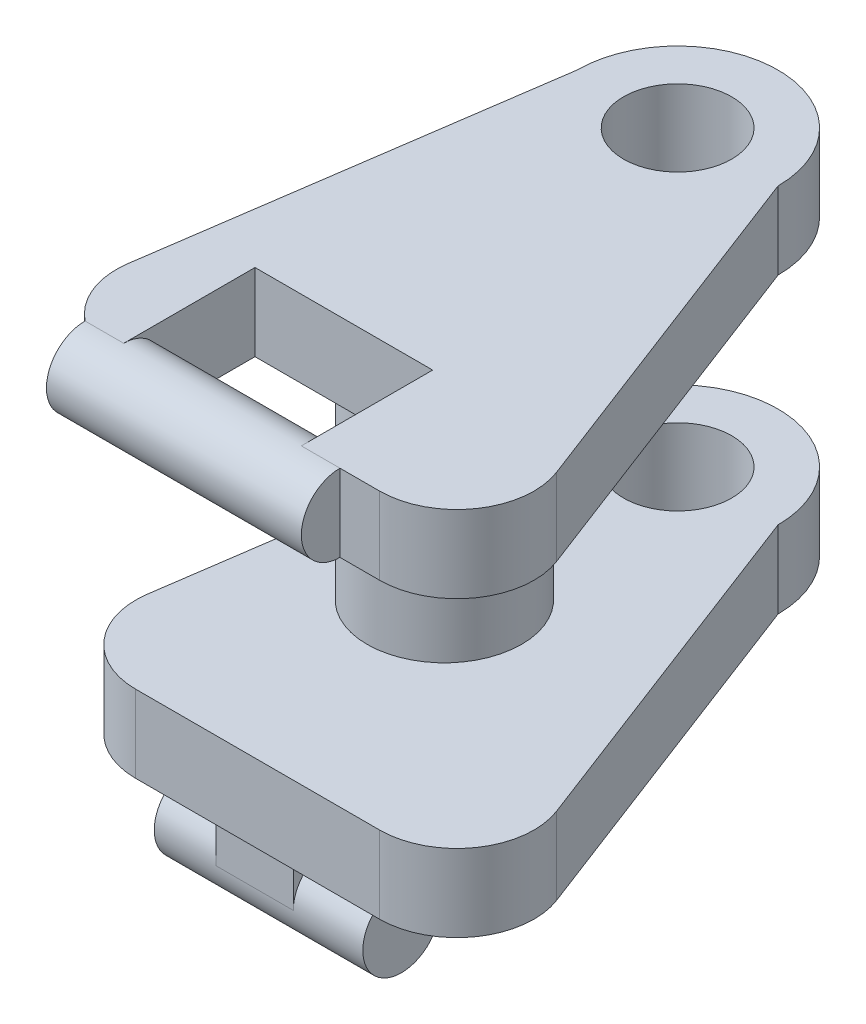
ISO-10303-21;
HEADER;
FILE_DESCRIPTION(('STEP AP214'),'2;1');
FILE_NAME('part.step','',(''),(''),'','','');
FILE_SCHEMA(('AUTOMOTIVE_DESIGN { 1 0 10303 214 1 1 1 1 }'));
ENDSEC;
DATA;
#1=APPLICATION_CONTEXT('core data for automotive mechanical design processes');
#2=APPLICATION_PROTOCOL_DEFINITION('international standard','automotive_design',2000,#1);
#3=PRODUCT_CONTEXT('',#1,'mechanical');
#4=PRODUCT('Part','Part','',(#3));
#5=PRODUCT_RELATED_PRODUCT_CATEGORY('part','',(#4));
#6=PRODUCT_DEFINITION_FORMATION('','',#4);
#7=PRODUCT_DEFINITION_CONTEXT('part definition',#1,'design');
#8=PRODUCT_DEFINITION('design','',#6,#7);
#9=PRODUCT_DEFINITION_SHAPE('','',#8);
#10=(LENGTH_UNIT() NAMED_UNIT(*) SI_UNIT(.MILLI.,.METRE.));
#11=(NAMED_UNIT(*) PLANE_ANGLE_UNIT() SI_UNIT($,.RADIAN.));
#12=(NAMED_UNIT(*) SI_UNIT($,.STERADIAN.) SOLID_ANGLE_UNIT());
#13=UNCERTAINTY_MEASURE_WITH_UNIT(LENGTH_MEASURE(1.E-05),#10,'distance_accuracy_value','');
#14=(GEOMETRIC_REPRESENTATION_CONTEXT(3) GLOBAL_UNCERTAINTY_ASSIGNED_CONTEXT((#13)) GLOBAL_UNIT_ASSIGNED_CONTEXT((#10,
#11,#12)) REPRESENTATION_CONTEXT('',''));
#15=CARTESIAN_POINT('',(0.,0.,0.));
#16=DIRECTION('',(0.,0.,1.));
#17=DIRECTION('',(1.,0.,0.));
#18=AXIS2_PLACEMENT_3D('',#15,#16,#17);
#19=CARTESIAN_POINT('',(16.0525087599727,-38.,-30.));
#20=DIRECTION('',(0.,-1.,0.));
#21=DIRECTION('',(0.,0.,-1.));
#22=AXIS2_PLACEMENT_3D('',#19,#20,#21);
#23=PLANE('',#22);
#24=DIRECTION('',(-0.357343434528091,0.,-0.933973056249305));
#25=VECTOR('',#24,1.);
#26=CARTESIAN_POINT('',(45.5378309625569,-38.,-17.4230346456334));
#27=LINE('',#26,#25);
#28=CARTESIAN_POINT('',(47.0107100608177,-38.,-13.5734343452809));
#29=VERTEX_POINT('',#28);
#30=CARTESIAN_POINT('',(29.2476404375621,-38.,-60.));
#31=VERTEX_POINT('',#30);
#32=EDGE_CURVE('E256',#29,#31,#27,.T.);
#33=ORIENTED_EDGE('',*,*,#32,.F.);
#34=CARTESIAN_POINT('',(37.6709794983246,-38.,-10.));
#35=DIRECTION('',(0.,-1.,0.));
#36=DIRECTION('',(0.,0.,-1.));
#37=AXIS2_PLACEMENT_3D('',#34,#35,#36);
#38=CIRCLE('',#37,10.);
#39=CARTESIAN_POINT('',(37.6709794983246,-38.,0.));
#40=VERTEX_POINT('',#39);
#41=EDGE_CURVE('E335',#29,#40,#38,.T.);
#42=ORIENTED_EDGE('',*,*,#41,.T.);
#43=DIRECTION('',(1.,0.,0.));
#44=VECTOR('',#43,1.);
#45=CARTESIAN_POINT('',(0.,-38.,0.));
#46=LINE('',#45,#44);
#47=CARTESIAN_POINT('',(6.09364936911274,-38.,0.));
#48=VERTEX_POINT('',#47);
#49=EDGE_CURVE('E258',#48,#40,#46,.T.);
#50=ORIENTED_EDGE('',*,*,#49,.F.);
#51=CARTESIAN_POINT('',(6.09364936911274,-38.,-10.));
#52=DIRECTION('',(0.,-1.,0.));
#53=DIRECTION('',(0.,0.,-1.));
#54=AXIS2_PLACEMENT_3D('',#51,#52,#53);
#55=CIRCLE('',#54,10.);
#56=CARTESIAN_POINT('',(-3.80260666620653,-38.,-11.4367033386914));
#57=VERTEX_POINT('',#56);
#58=EDGE_CURVE('E333',#48,#57,#55,.T.);
#59=ORIENTED_EDGE('',*,*,#58,.T.);
#60=DIRECTION('',(-0.143670333869138,0.,0.989625603531927));
#61=VECTOR('',#60,1.);
#62=CARTESIAN_POINT('',(-5.3501850959242,-38.,-0.776720889445257));
#63=LINE('',#62,#61);
#64=CARTESIAN_POINT('',(3.24764043756206,-38.,-60.));
#65=VERTEX_POINT('',#64);
#66=EDGE_CURVE('E249',#65,#57,#63,.T.);
#67=ORIENTED_EDGE('',*,*,#66,.F.);
#68=CARTESIAN_POINT('',(16.2476404375621,-38.,-60.));
#69=DIRECTION('',(0.,-1.,0.));
#70=DIRECTION('',(0.,0.,-1.));
#71=AXIS2_PLACEMENT_3D('',#68,#69,#70);
#72=CIRCLE('',#71,13.);
#73=EDGE_CURVE('E252',#65,#31,#72,.T.);
#74=ORIENTED_EDGE('',*,*,#73,.T.);
#75=EDGE_LOOP('',(#33,#42,#50,#59,#67,#74));
#76=FACE_BOUND('',#75,.T.);
#77=CARTESIAN_POINT('',(16.2476404375621,-38.,-60.));
#78=DIRECTION('',(0.,-1.,0.));
#79=DIRECTION('',(0.,0.,-1.));
#80=AXIS2_PLACEMENT_3D('',#77,#78,#79);
#81=CIRCLE('',#80,7.);
#82=CARTESIAN_POINT('',(16.2476404375621,-38.,-67.));
#83=VERTEX_POINT('',#82);
#84=EDGE_CURVE('E261',#83,#83,#81,.T.);
#85=ORIENTED_EDGE('',*,*,#84,.F.);
#86=EDGE_LOOP('',(#85));
#87=FACE_BOUND('',#86,.T.);
#88=DIRECTION('',(0.,0.,1.));
#89=VECTOR('',#88,1.);
#90=CARTESIAN_POINT('',(21.0936493691127,-38.,0.));
#91=LINE('',#90,#89);
#92=CARTESIAN_POINT('',(21.0936493691127,-38.,-15.3991887663422));
#93=VERTEX_POINT('',#92);
#94=CARTESIAN_POINT('',(21.0936493691127,-38.,-5.39918876634219));
#95=VERTEX_POINT('',#94);
#96=EDGE_CURVE('E50',#93,#95,#91,.T.);
#97=ORIENTED_EDGE('',*,*,#96,.F.);
#98=DIRECTION('',(1.,0.,0.));
#99=VECTOR('',#98,1.);
#100=CARTESIAN_POINT('',(0.,-38.,-15.3991887663422));
#101=LINE('',#100,#99);
#102=CARTESIAN_POINT('',(11.0936493691127,-38.,-15.3991887663422));
#103=VERTEX_POINT('',#102);
#104=EDGE_CURVE('E726',#103,#93,#101,.T.);
#105=ORIENTED_EDGE('',*,*,#104,.F.);
#106=DIRECTION('',(0.,0.,1.));
#107=VECTOR('',#106,1.);
#108=CARTESIAN_POINT('',(11.0936493691127,-38.,0.));
#109=LINE('',#108,#107);
#110=CARTESIAN_POINT('',(11.0936493691127,-38.,-5.39918876634219));
#111=VERTEX_POINT('',#110);
#112=EDGE_CURVE('E727',#103,#111,#109,.T.);
#113=ORIENTED_EDGE('',*,*,#112,.T.);
#114=DIRECTION('',(1.,0.,0.));
#115=VECTOR('',#114,1.);
#116=CARTESIAN_POINT('',(0.,-38.,-5.39918876634219));
#117=LINE('',#116,#115);
#118=EDGE_CURVE('E55',#111,#95,#117,.T.);
#119=ORIENTED_EDGE('',*,*,#118,.T.);
#120=EDGE_LOOP('',(#97,#105,#113,#119));
#121=FACE_BOUND('',#120,.T.);
#122=ADVANCED_FACE('F35',(#76,#87,#121),#23,.T.);
#123=CARTESIAN_POINT('',(0.,10.,0.));
#124=DIRECTION('',(0.,0.,-1.));
#125=DIRECTION('',(-1.,0.,0.));
#126=AXIS2_PLACEMENT_3D('',#123,#124,#125);
#127=PLANE('',#126);
#128=DIRECTION('',(1.,0.,0.));
#129=VECTOR('',#128,1.);
#130=CARTESIAN_POINT('',(0.,0.,0.));
#131=LINE('',#130,#129);
#132=CARTESIAN_POINT('',(32.5370533211989,0.,0.));
#133=VERTEX_POINT('',#132);
#134=CARTESIAN_POINT('',(37.6709794983246,0.,0.));
#135=VERTEX_POINT('',#134);
#136=EDGE_CURVE('E306',#133,#135,#131,.T.);
#137=ORIENTED_EDGE('',*,*,#136,.T.);
#138=DIRECTION('',(0.,-1.,0.));
#139=VECTOR('',#138,1.);
#140=CARTESIAN_POINT('',(37.6709794983246,10.,0.));
#141=LINE('',#140,#139);
#142=CARTESIAN_POINT('',(37.6709794983246,10.,0.));
#143=VERTEX_POINT('',#142);
#144=EDGE_CURVE('E350',#135,#143,#141,.F.);
#145=ORIENTED_EDGE('',*,*,#144,.T.);
#146=DIRECTION('',(1.,0.,0.));
#147=VECTOR('',#146,1.);
#148=CARTESIAN_POINT('',(0.,10.,0.));
#149=LINE('',#148,#147);
#150=CARTESIAN_POINT('',(32.5370533211989,10.,0.));
#151=VERTEX_POINT('',#150);
#152=EDGE_CURVE('E291',#151,#143,#149,.T.);
#153=ORIENTED_EDGE('',*,*,#152,.F.);
#154=DIRECTION('',(0.,1.,0.));
#155=VECTOR('',#154,1.);
#156=CARTESIAN_POINT('',(32.5370533211989,10.,0.));
#157=LINE('',#156,#155);
#158=EDGE_CURVE('E224',#133,#151,#157,.T.);
#159=ORIENTED_EDGE('',*,*,#158,.F.);
#160=EDGE_LOOP('',(#137,#145,#153,#159));
#161=FACE_BOUND('',#160,.T.);
#162=ADVANCED_FACE('F376',(#161),#127,.F.);
#163=CARTESIAN_POINT('',(16.0525087599727,-28.,-30.));
#164=DIRECTION('',(0.,1.,0.));
#165=DIRECTION('',(0.,0.,1.));
#166=AXIS2_PLACEMENT_3D('',#163,#164,#165);
#167=CYLINDRICAL_SURFACE('',#166,10.);
#168=CARTESIAN_POINT('',(16.0525087599727,0.,-30.));
#169=DIRECTION('',(0.,1.,0.));
#170=DIRECTION('',(0.,0.,1.));
#171=AXIS2_PLACEMENT_3D('',#168,#169,#170);
#172=CIRCLE('',#171,10.);
#173=CARTESIAN_POINT('',(16.0525087599727,0.,-20.));
#174=VERTEX_POINT('',#173);
#175=EDGE_CURVE('E316',#174,#174,#172,.F.);
#176=ORIENTED_EDGE('',*,*,#175,.T.);
#177=EDGE_LOOP('',(#176));
#178=FACE_BOUND('',#177,.T.);
#179=CARTESIAN_POINT('',(16.0525087599727,-28.,-30.));
#180=DIRECTION('',(0.,-1.,0.));
#181=DIRECTION('',(0.,0.,-1.));
#182=AXIS2_PLACEMENT_3D('',#179,#180,#181);
#183=CIRCLE('',#182,10.);
#184=CARTESIAN_POINT('',(16.0525087599727,-28.,-40.));
#185=VERTEX_POINT('',#184);
#186=EDGE_CURVE('E319',#185,#185,#183,.T.);
#187=ORIENTED_EDGE('',*,*,#186,.F.);
#188=EDGE_LOOP('',(#187));
#189=FACE_BOUND('',#188,.T.);
#190=ADVANCED_FACE('F418',(#178,#189),#167,.T.);
#191=CARTESIAN_POINT('',(45.5378309625569,10.,-17.4230346456334));
#192=DIRECTION('',(0.933973056249305,0.,-0.357343434528091));
#193=DIRECTION('',(-0.357343434528091,0.,-0.933973056249305));
#194=AXIS2_PLACEMENT_3D('',#191,#192,#193);
#195=PLANE('',#194);
#196=DIRECTION('',(0.357343434528091,0.,0.933973056249305));
#197=VECTOR('',#196,1.);
#198=CARTESIAN_POINT('',(45.5378309625569,10.,-17.4230346456334));
#199=LINE('',#198,#197);
#200=CARTESIAN_POINT('',(29.2476404375621,10.,-60.));
#201=VERTEX_POINT('',#200);
#202=CARTESIAN_POINT('',(47.0107100608177,10.,-13.5734343452809));
#203=VERTEX_POINT('',#202);
#204=EDGE_CURVE('E282',#201,#203,#199,.T.);
#205=ORIENTED_EDGE('',*,*,#204,.T.);
#206=DIRECTION('',(0.,-1.,0.));
#207=VECTOR('',#206,1.);
#208=CARTESIAN_POINT('',(47.0107100608177,0.,-13.5734343452809));
#209=LINE('',#208,#207);
#210=CARTESIAN_POINT('',(47.0107100608177,0.,-13.5734343452809));
#211=VERTEX_POINT('',#210);
#212=EDGE_CURVE('E343',#203,#211,#209,.T.);
#213=ORIENTED_EDGE('',*,*,#212,.T.);
#214=DIRECTION('',(0.357343434528091,0.,0.933973056249305));
#215=VECTOR('',#214,1.);
#216=CARTESIAN_POINT('',(45.5378309625569,0.,-17.4230346456334));
#217=LINE('',#216,#215);
#218=CARTESIAN_POINT('',(29.2476404375621,0.,-60.));
#219=VERTEX_POINT('',#218);
#220=EDGE_CURVE('E281',#219,#211,#217,.T.);
#221=ORIENTED_EDGE('',*,*,#220,.F.);
#222=DIRECTION('',(0.,-1.,0.));
#223=VECTOR('',#222,1.);
#224=CARTESIAN_POINT('',(29.2476404375621,10.,-60.));
#225=LINE('',#224,#223);
#226=EDGE_CURVE('E314',#201,#219,#225,.T.);
#227=ORIENTED_EDGE('',*,*,#226,.F.);
#228=EDGE_LOOP('',(#205,#213,#221,#227));
#229=FACE_BOUND('',#228,.T.);
#230=ADVANCED_FACE('F364',(#229),#195,.T.);
#231=CARTESIAN_POINT('',(16.2476404375621,10.,-60.));
#232=DIRECTION('',(0.,-1.,0.));
#233=DIRECTION('',(0.,0.,-1.));
#234=AXIS2_PLACEMENT_3D('',#231,#232,#233);
#235=CYLINDRICAL_SURFACE('',#234,13.);
#236=CARTESIAN_POINT('',(16.2476404375621,0.,-60.));
#237=DIRECTION('',(0.,1.,0.));
#238=DIRECTION('',(0.,0.,1.));
#239=AXIS2_PLACEMENT_3D('',#236,#237,#238);
#240=CIRCLE('',#239,13.);
#241=CARTESIAN_POINT('',(3.24764043756206,0.,-60.));
#242=VERTEX_POINT('',#241);
#243=EDGE_CURVE('E301',#219,#242,#240,.T.);
#244=ORIENTED_EDGE('',*,*,#243,.T.);
#245=DIRECTION('',(0.,-1.,0.));
#246=VECTOR('',#245,1.);
#247=CARTESIAN_POINT('',(3.24764043756206,10.,-60.));
#248=LINE('',#247,#246);
#249=CARTESIAN_POINT('',(3.24764043756206,10.,-60.));
#250=VERTEX_POINT('',#249);
#251=EDGE_CURVE('E298',#250,#242,#248,.T.);
#252=ORIENTED_EDGE('',*,*,#251,.F.);
#253=CARTESIAN_POINT('',(16.2476404375621,10.,-60.));
#254=DIRECTION('',(0.,1.,0.));
#255=DIRECTION('',(0.,0.,1.));
#256=AXIS2_PLACEMENT_3D('',#253,#254,#255);
#257=CIRCLE('',#256,13.);
#258=EDGE_CURVE('E285',#201,#250,#257,.T.);
#259=ORIENTED_EDGE('',*,*,#258,.F.);
#260=ORIENTED_EDGE('',*,*,#226,.T.);
#261=EDGE_LOOP('',(#244,#252,#259,#260));
#262=FACE_BOUND('',#261,.T.);
#263=ADVANCED_FACE('F409',(#262),#235,.T.);
#264=CARTESIAN_POINT('',(-5.3501850959242,10.,-0.776720889445257));
#265=DIRECTION('',(0.989625603531927,0.,0.143670333869138));
#266=DIRECTION('',(0.143670333869138,0.,-0.989625603531927));
#267=AXIS2_PLACEMENT_3D('',#264,#265,#266);
#268=PLANE('',#267);
#269=DIRECTION('',(-0.143670333869138,0.,0.989625603531927));
#270=VECTOR('',#269,1.);
#271=CARTESIAN_POINT('',(-5.3501850959242,0.,-0.776720889445257));
#272=LINE('',#271,#270);
#273=CARTESIAN_POINT('',(-4.11985181042444,0.,-9.25146503055053));
#274=VERTEX_POINT('',#273);
#275=EDGE_CURVE('E303',#242,#274,#272,.T.);
#276=ORIENTED_EDGE('',*,*,#275,.T.);
#277=DIRECTION('',(0.,1.,0.));
#278=VECTOR('',#277,1.);
#279=CARTESIAN_POINT('',(-4.11985181042444,10.,-9.25146503055053));
#280=LINE('',#279,#278);
#281=CARTESIAN_POINT('',(-4.11985181042445,10.,-9.25146503055053));
#282=VERTEX_POINT('',#281);
#283=EDGE_CURVE('E11',#274,#282,#280,.T.);
#284=ORIENTED_EDGE('',*,*,#283,.T.);
#285=DIRECTION('',(-0.143670333869138,0.,0.989625603531927));
#286=VECTOR('',#285,1.);
#287=CARTESIAN_POINT('',(-5.3501850959242,10.,-0.776720889445257));
#288=LINE('',#287,#286);
#289=EDGE_CURVE('E288',#250,#282,#288,.T.);
#290=ORIENTED_EDGE('',*,*,#289,.F.);
#291=ORIENTED_EDGE('',*,*,#251,.T.);
#292=EDGE_LOOP('',(#276,#284,#290,#291));
#293=FACE_BOUND('',#292,.T.);
#294=ADVANCED_FACE('F406',(#293),#268,.F.);
#295=CARTESIAN_POINT('',(16.2476404375621,10.,-60.));
#296=DIRECTION('',(0.,-1.,0.));
#297=DIRECTION('',(0.,0.,-1.));
#298=AXIS2_PLACEMENT_3D('',#295,#296,#297);
#299=CYLINDRICAL_SURFACE('',#298,7.);
#300=CARTESIAN_POINT('',(16.2476404375621,10.,-60.));
#301=DIRECTION('',(0.,1.,0.));
#302=DIRECTION('',(0.,0.,1.));
#303=AXIS2_PLACEMENT_3D('',#300,#301,#302);
#304=CIRCLE('',#303,7.);
#305=CARTESIAN_POINT('',(16.2476404375621,10.,-53.));
#306=VERTEX_POINT('',#305);
#307=EDGE_CURVE('E295',#306,#306,#304,.T.);
#308=ORIENTED_EDGE('',*,*,#307,.T.);
#309=EDGE_LOOP('',(#308));
#310=FACE_BOUND('',#309,.T.);
#311=CARTESIAN_POINT('',(16.2476404375621,0.,-60.));
#312=DIRECTION('',(0.,1.,0.));
#313=DIRECTION('',(0.,0.,1.));
#314=AXIS2_PLACEMENT_3D('',#311,#312,#313);
#315=CIRCLE('',#314,7.);
#316=CARTESIAN_POINT('',(16.2476404375621,0.,-53.));
#317=VERTEX_POINT('',#316);
#318=EDGE_CURVE('E286',#317,#317,#315,.T.);
#319=ORIENTED_EDGE('',*,*,#318,.F.);
#320=EDGE_LOOP('',(#319));
#321=FACE_BOUND('',#320,.T.);
#322=ADVANCED_FACE('F416',(#310,#321),#299,.F.);
#323=CARTESIAN_POINT('',(0.,10.,0.));
#324=DIRECTION('',(0.,1.,0.));
#325=DIRECTION('',(0.,0.,1.));
#326=AXIS2_PLACEMENT_3D('',#323,#324,#325);
#327=PLANE('',#326);
#328=ORIENTED_EDGE('',*,*,#152,.T.);
#329=CARTESIAN_POINT('',(37.6709794983246,10.,-10.));
#330=DIRECTION('',(0.,1.,0.));
#331=DIRECTION('',(0.,0.,1.));
#332=AXIS2_PLACEMENT_3D('',#329,#330,#331);
#333=CIRCLE('',#332,10.);
#334=EDGE_CURVE('E43',#143,#203,#333,.T.);
#335=ORIENTED_EDGE('',*,*,#334,.T.);
#336=ORIENTED_EDGE('',*,*,#204,.F.);
#337=ORIENTED_EDGE('',*,*,#258,.T.);
#338=ORIENTED_EDGE('',*,*,#289,.T.);
#339=CARTESIAN_POINT('',(5.77640422489483,10.,-7.81476169185915));
#340=DIRECTION('',(0.,1.,0.));
#341=DIRECTION('',(0.,0.,1.));
#342=AXIS2_PLACEMENT_3D('',#339,#340,#341);
#343=CIRCLE('',#342,10.);
#344=CARTESIAN_POINT('',(-0.462946678801066,10.,0.));
#345=VERTEX_POINT('',#344);
#346=EDGE_CURVE('E352',#282,#345,#343,.T.);
#347=ORIENTED_EDGE('',*,*,#346,.T.);
#348=DIRECTION('',(-1.,0.,0.));
#349=VECTOR('',#348,1.);
#350=CARTESIAN_POINT('',(32.5370533211989,10.,0.));
#351=LINE('',#350,#349);
#352=CARTESIAN_POINT('',(4.53705332119893,10.,0.));
#353=VERTEX_POINT('',#352);
#354=EDGE_CURVE('E216',#353,#345,#351,.T.);
#355=ORIENTED_EDGE('',*,*,#354,.F.);
#356=DIRECTION('',(0.,0.,1.));
#357=VECTOR('',#356,1.);
#358=CARTESIAN_POINT('',(4.53705332119893,10.,-17.));
#359=LINE('',#358,#357);
#360=CARTESIAN_POINT('',(4.53705332119893,10.,-17.));
#361=VERTEX_POINT('',#360);
#362=EDGE_CURVE('E241',#361,#353,#359,.T.);
#363=ORIENTED_EDGE('',*,*,#362,.F.);
#364=DIRECTION('',(-1.,0.,0.));
#365=VECTOR('',#364,1.);
#366=CARTESIAN_POINT('',(0.,10.,-17.));
#367=LINE('',#366,#365);
#368=CARTESIAN_POINT('',(27.5370533211989,10.,-17.));
#369=VERTEX_POINT('',#368);
#370=EDGE_CURVE('E232',#369,#361,#367,.T.);
#371=ORIENTED_EDGE('',*,*,#370,.F.);
#372=DIRECTION('',(0.,0.,1.));
#373=VECTOR('',#372,1.);
#374=CARTESIAN_POINT('',(27.5370533211989,10.,-17.));
#375=LINE('',#374,#373);
#376=CARTESIAN_POINT('',(27.5370533211989,10.,0.));
#377=VERTEX_POINT('',#376);
#378=EDGE_CURVE('E244',#369,#377,#375,.T.);
#379=ORIENTED_EDGE('',*,*,#378,.T.);
#380=EDGE_CURVE('E294',#377,#151,#149,.T.);
#381=ORIENTED_EDGE('',*,*,#380,.T.);
#382=EDGE_LOOP('',(#328,#335,#336,#337,#338,#347,#355,#363,#371,#379,#381));
#383=FACE_BOUND('',#382,.T.);
#384=ORIENTED_EDGE('',*,*,#307,.F.);
#385=EDGE_LOOP('',(#384));
#386=FACE_BOUND('',#385,.T.);
#387=ADVANCED_FACE('F356',(#383,#386),#327,.T.);
#388=CARTESIAN_POINT('',(0.,0.,0.));
#389=DIRECTION('',(0.,1.,0.));
#390=DIRECTION('',(0.,0.,1.));
#391=AXIS2_PLACEMENT_3D('',#388,#389,#390);
#392=PLANE('',#391);
#393=ORIENTED_EDGE('',*,*,#175,.F.);
#394=EDGE_LOOP('',(#393));
#395=FACE_BOUND('',#394,.T.);
#396=ORIENTED_EDGE('',*,*,#220,.T.);
#397=CARTESIAN_POINT('',(37.6709794983246,0.,-10.));
#398=DIRECTION('',(0.,1.,0.));
#399=DIRECTION('',(0.,0.,1.));
#400=AXIS2_PLACEMENT_3D('',#397,#398,#399);
#401=CIRCLE('',#400,10.);
#402=EDGE_CURVE('E348',#211,#135,#401,.F.);
#403=ORIENTED_EDGE('',*,*,#402,.T.);
#404=ORIENTED_EDGE('',*,*,#136,.F.);
#405=CARTESIAN_POINT('',(27.5370533211989,0.,0.));
#406=VERTEX_POINT('',#405);
#407=EDGE_CURVE('E309',#406,#133,#131,.T.);
#408=ORIENTED_EDGE('',*,*,#407,.F.);
#409=DIRECTION('',(0.,0.,1.));
#410=VECTOR('',#409,1.);
#411=CARTESIAN_POINT('',(27.5370533211989,0.,-17.));
#412=LINE('',#411,#410);
#413=CARTESIAN_POINT('',(27.5370533211989,0.,-17.));
#414=VERTEX_POINT('',#413);
#415=EDGE_CURVE('E236',#414,#406,#412,.T.);
#416=ORIENTED_EDGE('',*,*,#415,.F.);
#417=DIRECTION('',(1.,0.,0.));
#418=VECTOR('',#417,1.);
#419=CARTESIAN_POINT('',(0.,0.,-17.));
#420=LINE('',#419,#418);
#421=CARTESIAN_POINT('',(4.53705332119893,0.,-17.));
#422=VERTEX_POINT('',#421);
#423=EDGE_CURVE('E226',#422,#414,#420,.T.);
#424=ORIENTED_EDGE('',*,*,#423,.F.);
#425=DIRECTION('',(0.,0.,1.));
#426=VECTOR('',#425,1.);
#427=CARTESIAN_POINT('',(4.53705332119893,0.,-17.));
#428=LINE('',#427,#426);
#429=CARTESIAN_POINT('',(4.53705332119893,0.,0.));
#430=VERTEX_POINT('',#429);
#431=EDGE_CURVE('E237',#422,#430,#428,.T.);
#432=ORIENTED_EDGE('',*,*,#431,.T.);
#433=DIRECTION('',(-1.,0.,0.));
#434=VECTOR('',#433,1.);
#435=CARTESIAN_POINT('',(32.5370533211989,0.,0.));
#436=LINE('',#435,#434);
#437=CARTESIAN_POINT('',(-0.462946678801066,0.,0.));
#438=VERTEX_POINT('',#437);
#439=EDGE_CURVE('E213',#430,#438,#436,.T.);
#440=ORIENTED_EDGE('',*,*,#439,.T.);
#441=CARTESIAN_POINT('',(5.77640422489483,0.,-7.81476169185915));
#442=DIRECTION('',(0.,1.,0.));
#443=DIRECTION('',(0.,0.,1.));
#444=AXIS2_PLACEMENT_3D('',#441,#442,#443);
#445=CIRCLE('',#444,10.);
#446=EDGE_CURVE('E346',#438,#274,#445,.F.);
#447=ORIENTED_EDGE('',*,*,#446,.T.);
#448=ORIENTED_EDGE('',*,*,#275,.F.);
#449=ORIENTED_EDGE('',*,*,#243,.F.);
#450=EDGE_LOOP('',(#396,#403,#404,#408,#416,#424,#432,#440,#447,#448,#449));
#451=FACE_BOUND('',#450,.T.);
#452=ORIENTED_EDGE('',*,*,#318,.T.);
#453=EDGE_LOOP('',(#452));
#454=FACE_BOUND('',#453,.T.);
#455=ADVANCED_FACE('F370',(#395,#451,#454),#392,.F.);
#456=CARTESIAN_POINT('',(-5.3501850959242,-38.,-0.776720889445257));
#457=DIRECTION('',(-0.989625603531927,0.,-0.143670333869138));
#458=DIRECTION('',(-0.143670333869138,0.,0.989625603531927));
#459=AXIS2_PLACEMENT_3D('',#456,#457,#458);
#460=PLANE('',#459);
#461=ORIENTED_EDGE('',*,*,#66,.T.);
#462=DIRECTION('',(0.,1.,0.));
#463=VECTOR('',#462,1.);
#464=CARTESIAN_POINT('',(-3.80260666620653,-38.,-11.4367033386914));
#465=LINE('',#464,#463);
#466=CARTESIAN_POINT('',(-3.80260666620653,-28.,-11.4367033386914));
#467=VERTEX_POINT('',#466);
#468=EDGE_CURVE('E337',#57,#467,#465,.T.);
#469=ORIENTED_EDGE('',*,*,#468,.T.);
#470=DIRECTION('',(-0.143670333869138,0.,0.989625603531927));
#471=VECTOR('',#470,1.);
#472=CARTESIAN_POINT('',(-5.3501850959242,-28.,-0.776720889445257));
#473=LINE('',#472,#471);
#474=CARTESIAN_POINT('',(3.24764043756206,-28.,-60.));
#475=VERTEX_POINT('',#474);
#476=EDGE_CURVE('E240',#475,#467,#473,.T.);
#477=ORIENTED_EDGE('',*,*,#476,.F.);
#478=DIRECTION('',(0.,1.,0.));
#479=VECTOR('',#478,1.);
#480=CARTESIAN_POINT('',(3.24764043756206,-38.,-60.));
#481=LINE('',#480,#479);
#482=EDGE_CURVE('E279',#65,#475,#481,.T.);
#483=ORIENTED_EDGE('',*,*,#482,.F.);
#484=EDGE_LOOP('',(#461,#469,#477,#483));
#485=FACE_BOUND('',#484,.T.);
#486=ADVANCED_FACE('F431',(#485),#460,.T.);
#487=CARTESIAN_POINT('',(16.2476404375621,-38.,-60.));
#488=DIRECTION('',(0.,1.,0.));
#489=DIRECTION('',(0.,0.,1.));
#490=AXIS2_PLACEMENT_3D('',#487,#488,#489);
#491=CYLINDRICAL_SURFACE('',#490,13.);
#492=CARTESIAN_POINT('',(16.2476404375621,-28.,-60.));
#493=DIRECTION('',(0.,-1.,0.));
#494=DIRECTION('',(0.,0.,-1.));
#495=AXIS2_PLACEMENT_3D('',#492,#493,#494);
#496=CIRCLE('',#495,13.);
#497=CARTESIAN_POINT('',(29.2476404375621,-28.,-60.));
#498=VERTEX_POINT('',#497);
#499=EDGE_CURVE('E267',#475,#498,#496,.T.);
#500=ORIENTED_EDGE('',*,*,#499,.T.);
#501=DIRECTION('',(0.,1.,0.));
#502=VECTOR('',#501,1.);
#503=CARTESIAN_POINT('',(29.2476404375621,-38.,-60.));
#504=LINE('',#503,#502);
#505=EDGE_CURVE('E264',#31,#498,#504,.T.);
#506=ORIENTED_EDGE('',*,*,#505,.F.);
#507=ORIENTED_EDGE('',*,*,#73,.F.);
#508=ORIENTED_EDGE('',*,*,#482,.T.);
#509=EDGE_LOOP('',(#500,#506,#507,#508));
#510=FACE_BOUND('',#509,.T.);
#511=ADVANCED_FACE('F466',(#510),#491,.T.);
#512=CARTESIAN_POINT('',(45.5378309625569,-38.,-17.4230346456334));
#513=DIRECTION('',(0.933973056249305,0.,-0.357343434528091));
#514=DIRECTION('',(-0.357343434528091,0.,-0.933973056249305));
#515=AXIS2_PLACEMENT_3D('',#512,#513,#514);
#516=PLANE('',#515);
#517=DIRECTION('',(-0.357343434528091,0.,-0.933973056249305));
#518=VECTOR('',#517,1.);
#519=CARTESIAN_POINT('',(45.5378309625569,-28.,-17.4230346456334));
#520=LINE('',#519,#518);
#521=CARTESIAN_POINT('',(47.0107100608177,-28.,-13.5734343452809));
#522=VERTEX_POINT('',#521);
#523=EDGE_CURVE('E270',#522,#498,#520,.T.);
#524=ORIENTED_EDGE('',*,*,#523,.F.);
#525=DIRECTION('',(0.,1.,0.));
#526=VECTOR('',#525,1.);
#527=CARTESIAN_POINT('',(47.0107100608177,-38.,-13.5734343452809));
#528=LINE('',#527,#526);
#529=EDGE_CURVE('E331',#522,#29,#528,.F.);
#530=ORIENTED_EDGE('',*,*,#529,.T.);
#531=ORIENTED_EDGE('',*,*,#32,.T.);
#532=ORIENTED_EDGE('',*,*,#505,.T.);
#533=EDGE_LOOP('',(#524,#530,#531,#532));
#534=FACE_BOUND('',#533,.T.);
#535=ADVANCED_FACE('F475',(#534),#516,.T.);
#536=CARTESIAN_POINT('',(0.,-38.,0.));
#537=DIRECTION('',(0.,0.,1.));
#538=DIRECTION('',(1.,0.,0.));
#539=AXIS2_PLACEMENT_3D('',#536,#537,#538);
#540=PLANE('',#539);
#541=ORIENTED_EDGE('',*,*,#49,.T.);
#542=DIRECTION('',(0.,1.,0.));
#543=VECTOR('',#542,1.);
#544=CARTESIAN_POINT('',(37.6709794983246,-38.,0.));
#545=LINE('',#544,#543);
#546=CARTESIAN_POINT('',(37.6709794983246,-28.,0.));
#547=VERTEX_POINT('',#546);
#548=EDGE_CURVE('E324',#40,#547,#545,.T.);
#549=ORIENTED_EDGE('',*,*,#548,.T.);
#550=DIRECTION('',(1.,0.,0.));
#551=VECTOR('',#550,1.);
#552=CARTESIAN_POINT('',(0.,-28.,0.));
#553=LINE('',#552,#551);
#554=CARTESIAN_POINT('',(6.09364936911274,-28.,0.));
#555=VERTEX_POINT('',#554);
#556=EDGE_CURVE('E272',#555,#547,#553,.T.);
#557=ORIENTED_EDGE('',*,*,#556,.F.);
#558=DIRECTION('',(0.,1.,0.));
#559=VECTOR('',#558,1.);
#560=CARTESIAN_POINT('',(6.09364936911274,-38.,0.));
#561=LINE('',#560,#559);
#562=EDGE_CURVE('E322',#555,#48,#561,.F.);
#563=ORIENTED_EDGE('',*,*,#562,.T.);
#564=EDGE_LOOP('',(#541,#549,#557,#563));
#565=FACE_BOUND('',#564,.T.);
#566=ADVANCED_FACE('F481',(#565),#540,.T.);
#567=CARTESIAN_POINT('',(16.2476404375621,-38.,-60.));
#568=DIRECTION('',(0.,1.,0.));
#569=DIRECTION('',(0.,0.,1.));
#570=AXIS2_PLACEMENT_3D('',#567,#568,#569);
#571=CYLINDRICAL_SURFACE('',#570,7.);
#572=ORIENTED_EDGE('',*,*,#84,.T.);
#573=EDGE_LOOP('',(#572));
#574=FACE_BOUND('',#573,.T.);
#575=CARTESIAN_POINT('',(16.2476404375621,-28.,-60.));
#576=DIRECTION('',(0.,-1.,0.));
#577=DIRECTION('',(0.,0.,-1.));
#578=AXIS2_PLACEMENT_3D('',#575,#576,#577);
#579=CIRCLE('',#578,7.);
#580=CARTESIAN_POINT('',(16.2476404375621,-28.,-67.));
#581=VERTEX_POINT('',#580);
#582=EDGE_CURVE('E253',#581,#581,#579,.T.);
#583=ORIENTED_EDGE('',*,*,#582,.F.);
#584=EDGE_LOOP('',(#583));
#585=FACE_BOUND('',#584,.T.);
#586=ADVANCED_FACE('F489',(#574,#585),#571,.F.);
#587=CARTESIAN_POINT('',(0.,-28.,0.));
#588=DIRECTION('',(0.,-1.,0.));
#589=DIRECTION('',(0.,0.,-1.));
#590=AXIS2_PLACEMENT_3D('',#587,#588,#589);
#591=PLANE('',#590);
#592=ORIENTED_EDGE('',*,*,#556,.T.);
#593=CARTESIAN_POINT('',(37.6709794983246,-28.,-10.));
#594=DIRECTION('',(0.,-1.,0.));
#595=DIRECTION('',(0.,0.,-1.));
#596=AXIS2_PLACEMENT_3D('',#593,#594,#595);
#597=CIRCLE('',#596,10.);
#598=EDGE_CURVE('E329',#547,#522,#597,.F.);
#599=ORIENTED_EDGE('',*,*,#598,.T.);
#600=ORIENTED_EDGE('',*,*,#523,.T.);
#601=ORIENTED_EDGE('',*,*,#499,.F.);
#602=ORIENTED_EDGE('',*,*,#476,.T.);
#603=CARTESIAN_POINT('',(6.09364936911274,-28.,-10.));
#604=DIRECTION('',(0.,-1.,0.));
#605=DIRECTION('',(0.,0.,-1.));
#606=AXIS2_PLACEMENT_3D('',#603,#604,#605);
#607=CIRCLE('',#606,10.);
#608=EDGE_CURVE('E327',#467,#555,#607,.F.);
#609=ORIENTED_EDGE('',*,*,#608,.T.);
#610=EDGE_LOOP('',(#592,#599,#600,#601,#602,#609));
#611=FACE_BOUND('',#610,.T.);
#612=ORIENTED_EDGE('',*,*,#186,.T.);
#613=EDGE_LOOP('',(#612));
#614=FACE_BOUND('',#613,.T.);
#615=ORIENTED_EDGE('',*,*,#582,.T.);
#616=EDGE_LOOP('',(#615));
#617=FACE_BOUND('',#616,.T.);
#618=ADVANCED_FACE('F497',(#611,#614,#617),#591,.F.);
#619=CARTESIAN_POINT('',(37.6709794983246,-38.,-10.));
#620=DIRECTION('',(0.,1.,0.));
#621=DIRECTION('',(0.,0.,1.));
#622=AXIS2_PLACEMENT_3D('',#619,#620,#621);
#623=CYLINDRICAL_SURFACE('',#622,10.);
#624=ORIENTED_EDGE('',*,*,#41,.F.);
#625=ORIENTED_EDGE('',*,*,#529,.F.);
#626=ORIENTED_EDGE('',*,*,#598,.F.);
#627=ORIENTED_EDGE('',*,*,#548,.F.);
#628=EDGE_LOOP('',(#624,#625,#626,#627));
#629=FACE_BOUND('',#628,.T.);
#630=ADVANCED_FACE('F504',(#629),#623,.T.);
#631=CARTESIAN_POINT('',(6.09364936911274,-38.,-10.));
#632=DIRECTION('',(0.,1.,0.));
#633=DIRECTION('',(0.,0.,1.));
#634=AXIS2_PLACEMENT_3D('',#631,#632,#633);
#635=CYLINDRICAL_SURFACE('',#634,10.);
#636=ORIENTED_EDGE('',*,*,#58,.F.);
#637=ORIENTED_EDGE('',*,*,#562,.F.);
#638=ORIENTED_EDGE('',*,*,#608,.F.);
#639=ORIENTED_EDGE('',*,*,#468,.F.);
#640=EDGE_LOOP('',(#636,#637,#638,#639));
#641=FACE_BOUND('',#640,.T.);
#642=ADVANCED_FACE('F512',(#641),#635,.T.);
#643=CARTESIAN_POINT('',(4.53705332119893,0.,-17.));
#644=DIRECTION('',(-1.,0.,0.));
#645=DIRECTION('',(0.,0.,1.));
#646=AXIS2_PLACEMENT_3D('',#643,#644,#645);
#647=PLANE('',#646);
#648=ORIENTED_EDGE('',*,*,#362,.T.);
#649=CARTESIAN_POINT('',(4.53705332119893,5.,0.));
#650=DIRECTION('',(-1.,0.,0.));
#651=DIRECTION('',(0.,0.,1.));
#652=AXIS2_PLACEMENT_3D('',#649,#650,#651);
#653=CIRCLE('',#652,5.);
#654=EDGE_CURVE('E212',#353,#430,#653,.T.);
#655=ORIENTED_EDGE('',*,*,#654,.T.);
#656=ORIENTED_EDGE('',*,*,#431,.F.);
#657=DIRECTION('',(0.,-1.,0.));
#658=VECTOR('',#657,1.);
#659=CARTESIAN_POINT('',(4.53705332119893,0.,-17.));
#660=LINE('',#659,#658);
#661=EDGE_CURVE('E234',#361,#422,#660,.T.);
#662=ORIENTED_EDGE('',*,*,#661,.F.);
#663=EDGE_LOOP('',(#648,#655,#656,#662));
#664=FACE_BOUND('',#663,.T.);
#665=ADVANCED_FACE('F393',(#664),#647,.F.);
#666=CARTESIAN_POINT('',(27.5370533211989,0.,-17.));
#667=DIRECTION('',(1.,0.,0.));
#668=DIRECTION('',(0.,0.,-1.));
#669=AXIS2_PLACEMENT_3D('',#666,#667,#668);
#670=PLANE('',#669);
#671=ORIENTED_EDGE('',*,*,#415,.T.);
#672=CARTESIAN_POINT('',(27.5370533211989,5.,0.));
#673=DIRECTION('',(1.,0.,0.));
#674=DIRECTION('',(0.,0.,-1.));
#675=AXIS2_PLACEMENT_3D('',#672,#673,#674);
#676=CIRCLE('',#675,5.);
#677=EDGE_CURVE('E340',#406,#377,#676,.T.);
#678=ORIENTED_EDGE('',*,*,#677,.T.);
#679=ORIENTED_EDGE('',*,*,#378,.F.);
#680=DIRECTION('',(0.,1.,0.));
#681=VECTOR('',#680,1.);
#682=CARTESIAN_POINT('',(27.5370533211989,0.,-17.));
#683=LINE('',#682,#681);
#684=EDGE_CURVE('E229',#414,#369,#683,.T.);
#685=ORIENTED_EDGE('',*,*,#684,.F.);
#686=EDGE_LOOP('',(#671,#678,#679,#685));
#687=FACE_BOUND('',#686,.T.);
#688=ADVANCED_FACE('F385',(#687),#670,.F.);
#689=CARTESIAN_POINT('',(0.,0.,-17.));
#690=DIRECTION('',(0.,0.,1.));
#691=DIRECTION('',(1.,0.,0.));
#692=AXIS2_PLACEMENT_3D('',#689,#690,#691);
#693=PLANE('',#692);
#694=ORIENTED_EDGE('',*,*,#423,.T.);
#695=ORIENTED_EDGE('',*,*,#684,.T.);
#696=ORIENTED_EDGE('',*,*,#370,.T.);
#697=ORIENTED_EDGE('',*,*,#661,.T.);
#698=EDGE_LOOP('',(#694,#695,#696,#697));
#699=FACE_BOUND('',#698,.T.);
#700=ADVANCED_FACE('F388',(#699),#693,.T.);
#701=CARTESIAN_POINT('',(32.5370533211989,5.,0.));
#702=DIRECTION('',(-1.,0.,0.));
#703=DIRECTION('',(0.,0.,1.));
#704=AXIS2_PLACEMENT_3D('',#701,#702,#703);
#705=PLANE('',#704);
#706=CARTESIAN_POINT('',(32.5370533211989,5.,0.));
#707=DIRECTION('',(-1.,0.,0.));
#708=DIRECTION('',(0.,0.,1.));
#709=AXIS2_PLACEMENT_3D('',#706,#707,#708);
#710=CIRCLE('',#709,5.);
#711=EDGE_CURVE('E209',#133,#151,#710,.T.);
#712=ORIENTED_EDGE('',*,*,#711,.F.);
#713=ORIENTED_EDGE('',*,*,#158,.T.);
#714=EDGE_LOOP('',(#712,#713));
#715=FACE_BOUND('',#714,.T.);
#716=ADVANCED_FACE('F379',(#715),#705,.F.);
#717=CARTESIAN_POINT('',(-0.462946678801066,5.,0.));
#718=DIRECTION('',(-1.,0.,0.));
#719=DIRECTION('',(0.,0.,1.));
#720=AXIS2_PLACEMENT_3D('',#717,#718,#719);
#721=PLANE('',#720);
#722=DIRECTION('',(0.,1.,0.));
#723=VECTOR('',#722,1.);
#724=CARTESIAN_POINT('',(-0.462946678801066,10.,0.));
#725=LINE('',#724,#723);
#726=EDGE_CURVE('E219',#438,#345,#725,.T.);
#727=ORIENTED_EDGE('',*,*,#726,.F.);
#728=CARTESIAN_POINT('',(-0.462946678801066,5.,0.));
#729=DIRECTION('',(-1.,0.,0.));
#730=DIRECTION('',(0.,0.,1.));
#731=AXIS2_PLACEMENT_3D('',#728,#729,#730);
#732=CIRCLE('',#731,5.);
#733=EDGE_CURVE('E206',#438,#345,#732,.T.);
#734=ORIENTED_EDGE('',*,*,#733,.T.);
#735=EDGE_LOOP('',(#727,#734));
#736=FACE_BOUND('',#735,.T.);
#737=ADVANCED_FACE('F400',(#736),#721,.T.);
#738=CARTESIAN_POINT('',(32.5370533211989,5.,0.));
#739=DIRECTION('',(-1.,0.,0.));
#740=DIRECTION('',(0.,0.,1.));
#741=AXIS2_PLACEMENT_3D('',#738,#739,#740);
#742=CYLINDRICAL_SURFACE('',#741,5.);
#743=ORIENTED_EDGE('',*,*,#654,.F.);
#744=ORIENTED_EDGE('',*,*,#354,.T.);
#745=ORIENTED_EDGE('',*,*,#733,.F.);
#746=ORIENTED_EDGE('',*,*,#439,.F.);
#747=EDGE_LOOP('',(#743,#744,#745,#746));
#748=FACE_BOUND('',#747,.T.);
#749=ORIENTED_EDGE('',*,*,#711,.T.);
#750=ORIENTED_EDGE('',*,*,#380,.F.);
#751=ORIENTED_EDGE('',*,*,#677,.F.);
#752=ORIENTED_EDGE('',*,*,#407,.T.);
#753=EDGE_LOOP('',(#749,#750,#751,#752));
#754=FACE_BOUND('',#753,.T.);
#755=ADVANCED_FACE('F381',(#748,#754),#742,.T.);
#756=CARTESIAN_POINT('',(37.6709794983246,10.,-10.));
#757=DIRECTION('',(0.,1.,0.));
#758=DIRECTION('',(0.,0.,1.));
#759=AXIS2_PLACEMENT_3D('',#756,#757,#758);
#760=CYLINDRICAL_SURFACE('',#759,10.);
#761=ORIENTED_EDGE('',*,*,#334,.F.);
#762=ORIENTED_EDGE('',*,*,#144,.F.);
#763=ORIENTED_EDGE('',*,*,#402,.F.);
#764=ORIENTED_EDGE('',*,*,#212,.F.);
#765=EDGE_LOOP('',(#761,#762,#763,#764));
#766=FACE_BOUND('',#765,.T.);
#767=ADVANCED_FACE('F367',(#766),#760,.T.);
#768=CARTESIAN_POINT('',(5.77640422489483,10.,-7.81476169185915));
#769=DIRECTION('',(0.,1.,0.));
#770=DIRECTION('',(0.,0.,1.));
#771=AXIS2_PLACEMENT_3D('',#768,#769,#770);
#772=CYLINDRICAL_SURFACE('',#771,10.);
#773=ORIENTED_EDGE('',*,*,#346,.F.);
#774=ORIENTED_EDGE('',*,*,#283,.F.);
#775=ORIENTED_EDGE('',*,*,#446,.F.);
#776=ORIENTED_EDGE('',*,*,#726,.T.);
#777=EDGE_LOOP('',(#773,#774,#775,#776));
#778=FACE_BOUND('',#777,.T.);
#779=ADVANCED_FACE('F37',(#778),#772,.T.);
#780=CARTESIAN_POINT('',(0.,-48.,-15.3991887663422));
#781=DIRECTION('',(0.,0.,1.));
#782=DIRECTION('',(1.,0.,0.));
#783=AXIS2_PLACEMENT_3D('',#780,#781,#782);
#784=PLANE('',#783);
#785=ORIENTED_EDGE('',*,*,#104,.T.);
#786=DIRECTION('',(0.,1.,0.));
#787=VECTOR('',#786,1.);
#788=CARTESIAN_POINT('',(21.0936493691127,-48.,-15.3991887663422));
#789=LINE('',#788,#787);
#790=CARTESIAN_POINT('',(21.0936493691127,-48.,-15.3991887663422));
#791=VERTEX_POINT('',#790);
#792=EDGE_CURVE('E200',#791,#93,#789,.T.);
#793=ORIENTED_EDGE('',*,*,#792,.F.);
#794=DIRECTION('',(1.,0.,0.));
#795=VECTOR('',#794,1.);
#796=CARTESIAN_POINT('',(0.,-48.,-15.3991887663422));
#797=LINE('',#796,#795);
#798=CARTESIAN_POINT('',(11.0936493691127,-48.,-15.3991887663422));
#799=VERTEX_POINT('',#798);
#800=EDGE_CURVE('E186',#799,#791,#797,.T.);
#801=ORIENTED_EDGE('',*,*,#800,.F.);
#802=DIRECTION('',(0.,1.,0.));
#803=VECTOR('',#802,1.);
#804=CARTESIAN_POINT('',(11.0936493691127,-48.,-15.3991887663422));
#805=LINE('',#804,#803);
#806=EDGE_CURVE('E185',#799,#103,#805,.T.);
#807=ORIENTED_EDGE('',*,*,#806,.T.);
#808=EDGE_LOOP('',(#785,#793,#801,#807));
#809=FACE_BOUND('',#808,.T.);
#810=ADVANCED_FACE('F568',(#809),#784,.F.);
#811=CARTESIAN_POINT('',(21.0936493691127,-48.,0.));
#812=DIRECTION('',(-1.,0.,0.));
#813=DIRECTION('',(0.,0.,1.));
#814=AXIS2_PLACEMENT_3D('',#811,#812,#813);
#815=PLANE('',#814);
#816=DIRECTION('',(0.,1.,0.));
#817=VECTOR('',#816,1.);
#818=CARTESIAN_POINT('',(21.0936493691127,-48.,-5.39918876634219));
#819=LINE('',#818,#817);
#820=CARTESIAN_POINT('',(21.0936493691127,-48.,-5.39918876634219));
#821=VERTEX_POINT('',#820);
#822=EDGE_CURVE('E198',#821,#95,#819,.T.);
#823=ORIENTED_EDGE('',*,*,#822,.F.);
#824=CARTESIAN_POINT('',(21.0936493691127,-48.,-10.3991887663422));
#825=DIRECTION('',(-1.,0.,0.));
#826=DIRECTION('',(0.,0.,1.));
#827=AXIS2_PLACEMENT_3D('',#824,#825,#826);
#828=CIRCLE('',#827,5.);
#829=EDGE_CURVE('E181',#821,#791,#828,.T.);
#830=ORIENTED_EDGE('',*,*,#829,.T.);
#831=ORIENTED_EDGE('',*,*,#792,.T.);
#832=ORIENTED_EDGE('',*,*,#96,.T.);
#833=EDGE_LOOP('',(#823,#830,#831,#832));
#834=FACE_BOUND('',#833,.T.);
#835=ADVANCED_FACE('F574',(#834),#815,.F.);
#836=CARTESIAN_POINT('',(0.,-48.,-5.39918876634219));
#837=DIRECTION('',(0.,0.,1.));
#838=DIRECTION('',(1.,0.,0.));
#839=AXIS2_PLACEMENT_3D('',#836,#837,#838);
#840=PLANE('',#839);
#841=ORIENTED_EDGE('',*,*,#118,.F.);
#842=DIRECTION('',(0.,1.,0.));
#843=VECTOR('',#842,1.);
#844=CARTESIAN_POINT('',(11.0936493691127,-48.,-5.39918876634219));
#845=LINE('',#844,#843);
#846=CARTESIAN_POINT('',(11.0936493691127,-48.,-5.39918876634219));
#847=VERTEX_POINT('',#846);
#848=EDGE_CURVE('E192',#847,#111,#845,.T.);
#849=ORIENTED_EDGE('',*,*,#848,.F.);
#850=DIRECTION('',(1.,0.,0.));
#851=VECTOR('',#850,1.);
#852=CARTESIAN_POINT('',(0.,-48.,-5.39918876634219));
#853=LINE('',#852,#851);
#854=EDGE_CURVE('E175',#847,#821,#853,.T.);
#855=ORIENTED_EDGE('',*,*,#854,.T.);
#856=ORIENTED_EDGE('',*,*,#822,.T.);
#857=EDGE_LOOP('',(#841,#849,#855,#856));
#858=FACE_BOUND('',#857,.T.);
#859=ADVANCED_FACE('F197',(#858),#840,.T.);
#860=CARTESIAN_POINT('',(11.0936493691127,-48.,0.));
#861=DIRECTION('',(-1.,0.,0.));
#862=DIRECTION('',(0.,0.,1.));
#863=AXIS2_PLACEMENT_3D('',#860,#861,#862);
#864=PLANE('',#863);
#865=CARTESIAN_POINT('',(11.0936493691127,-48.,-10.3991887663422));
#866=DIRECTION('',(-1.,0.,0.));
#867=DIRECTION('',(0.,0.,1.));
#868=AXIS2_PLACEMENT_3D('',#865,#866,#867);
#869=CIRCLE('',#868,5.);
#870=EDGE_CURVE('E178',#847,#799,#869,.T.);
#871=ORIENTED_EDGE('',*,*,#870,.F.);
#872=ORIENTED_EDGE('',*,*,#848,.T.);
#873=ORIENTED_EDGE('',*,*,#112,.F.);
#874=ORIENTED_EDGE('',*,*,#806,.F.);
#875=EDGE_LOOP('',(#871,#872,#873,#874));
#876=FACE_BOUND('',#875,.T.);
#877=ADVANCED_FACE('F190',(#876),#864,.T.);
#878=CARTESIAN_POINT('',(3.09364936911273,-48.,-10.3991887663422));
#879=DIRECTION('',(1.,0.,0.));
#880=DIRECTION('',(0.,0.,-1.));
#881=AXIS2_PLACEMENT_3D('',#878,#879,#880);
#882=CYLINDRICAL_SURFACE('',#881,5.);
#883=CARTESIAN_POINT('',(30.0936493691127,-48.,-10.3991887663422));
#884=DIRECTION('',(1.,0.,0.));
#885=DIRECTION('',(0.,0.,-1.));
#886=AXIS2_PLACEMENT_3D('',#883,#884,#885);
#887=CIRCLE('',#886,5.);
#888=CARTESIAN_POINT('',(30.0936493691127,-48.,-15.3991887663422));
#889=VERTEX_POINT('',#888);
#890=EDGE_CURVE('E720',#889,#889,#887,.T.);
#891=ORIENTED_EDGE('',*,*,#890,.F.);
#892=EDGE_LOOP('',(#891));
#893=FACE_BOUND('',#892,.T.);
#894=CARTESIAN_POINT('',(3.09364936911273,-48.,-10.3991887663422));
#895=DIRECTION('',(1.,0.,0.));
#896=DIRECTION('',(0.,0.,-1.));
#897=AXIS2_PLACEMENT_3D('',#894,#895,#896);
#898=CIRCLE('',#897,5.);
#899=CARTESIAN_POINT('',(3.09364936911273,-48.,-15.3991887663422));
#900=VERTEX_POINT('',#899);
#901=EDGE_CURVE('E195',#900,#900,#898,.T.);
#902=ORIENTED_EDGE('',*,*,#901,.T.);
#903=EDGE_LOOP('',(#902));
#904=FACE_BOUND('',#903,.T.);
#905=ORIENTED_EDGE('',*,*,#829,.F.);
#906=ORIENTED_EDGE('',*,*,#854,.F.);
#907=ORIENTED_EDGE('',*,*,#870,.T.);
#908=ORIENTED_EDGE('',*,*,#800,.T.);
#909=EDGE_LOOP('',(#905,#906,#907,#908));
#910=FACE_BOUND('',#909,.T.);
#911=ADVANCED_FACE('F177',(#893,#904,#910),#882,.T.);
#912=CARTESIAN_POINT('',(3.09364936911273,-48.,-10.3991887663422));
#913=DIRECTION('',(1.,0.,0.));
#914=DIRECTION('',(0.,0.,-1.));
#915=AXIS2_PLACEMENT_3D('',#912,#913,#914);
#916=PLANE('',#915);
#917=ORIENTED_EDGE('',*,*,#901,.F.);
#918=EDGE_LOOP('',(#917));
#919=FACE_BOUND('',#918,.T.);
#920=ADVANCED_FACE('F601',(#919),#916,.F.);
#921=CARTESIAN_POINT('',(30.0936493691127,-48.,-10.3991887663422));
#922=DIRECTION('',(1.,0.,0.));
#923=DIRECTION('',(0.,0.,-1.));
#924=AXIS2_PLACEMENT_3D('',#921,#922,#923);
#925=PLANE('',#924);
#926=ORIENTED_EDGE('',*,*,#890,.T.);
#927=EDGE_LOOP('',(#926));
#928=FACE_BOUND('',#927,.T.);
#929=ADVANCED_FACE('F609',(#928),#925,.T.);
#930=CLOSED_SHELL('',(#122,#162,#190,#230,#263,#294,#322,#387,#455,#486,#511,#535,#566,#586,
#618,#630,#642,#665,#688,#700,#716,#737,#755,#767,#779,#810,#835,#859,#877,#911,#920,#929));
#931=MANIFOLD_SOLID_BREP('B2',#930);
#932=ADVANCED_BREP_SHAPE_REPRESENTATION('',(#18,#931),#14);
#933=SHAPE_DEFINITION_REPRESENTATION(#9,#932);
ENDSEC;
END-ISO-10303-21;
